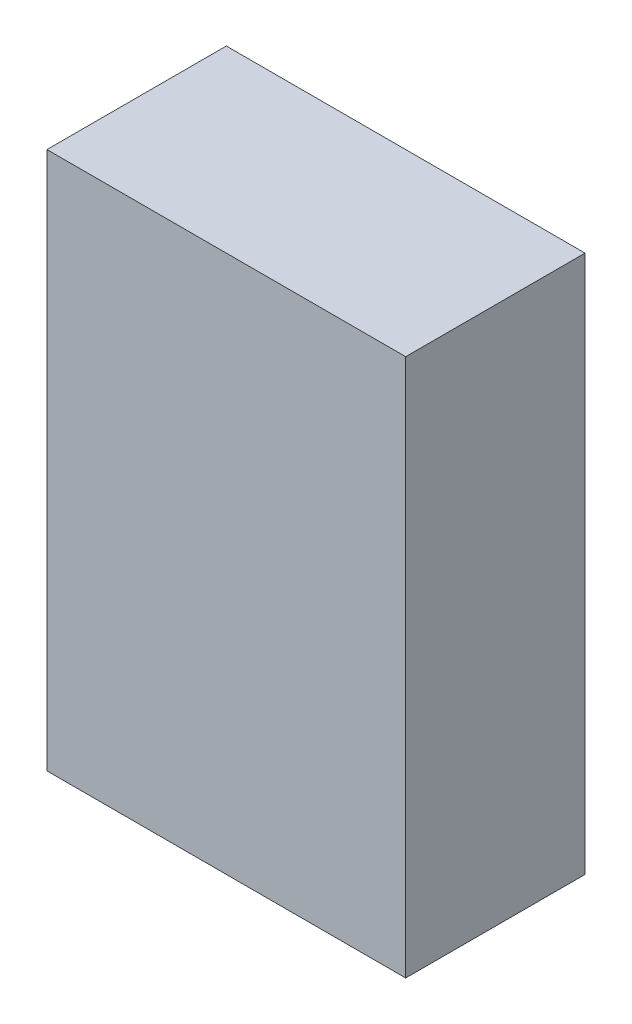
ISO-10303-21;
HEADER;
FILE_DESCRIPTION(('STEP AP214'),'2;1');
FILE_NAME('part.step','',(''),(''),'','','');
FILE_SCHEMA(('AUTOMOTIVE_DESIGN { 1 0 10303 214 1 1 1 1 }'));
ENDSEC;
DATA;
#1=APPLICATION_CONTEXT('core data for automotive mechanical design processes');
#2=APPLICATION_PROTOCOL_DEFINITION('international standard','automotive_design',2000,#1);
#3=PRODUCT_CONTEXT('',#1,'mechanical');
#4=PRODUCT('Part','Part','',(#3));
#5=PRODUCT_RELATED_PRODUCT_CATEGORY('part','',(#4));
#6=PRODUCT_DEFINITION_FORMATION('','',#4);
#7=PRODUCT_DEFINITION_CONTEXT('part definition',#1,'design');
#8=PRODUCT_DEFINITION('design','',#6,#7);
#9=PRODUCT_DEFINITION_SHAPE('','',#8);
#10=(LENGTH_UNIT() NAMED_UNIT(*) SI_UNIT(.MILLI.,.METRE.));
#11=(NAMED_UNIT(*) PLANE_ANGLE_UNIT() SI_UNIT($,.RADIAN.));
#12=(NAMED_UNIT(*) SI_UNIT($,.STERADIAN.) SOLID_ANGLE_UNIT());
#13=UNCERTAINTY_MEASURE_WITH_UNIT(LENGTH_MEASURE(1.E-05),#10,'distance_accuracy_value','');
#14=(GEOMETRIC_REPRESENTATION_CONTEXT(3) GLOBAL_UNCERTAINTY_ASSIGNED_CONTEXT((#13)) GLOBAL_UNIT_ASSIGNED_CONTEXT((#10,
#11,#12)) REPRESENTATION_CONTEXT('',''));
#15=CARTESIAN_POINT('',(0.,0.,0.));
#16=DIRECTION('',(0.,0.,1.));
#17=DIRECTION('',(1.,0.,0.));
#18=AXIS2_PLACEMENT_3D('',#15,#16,#17);
#19=CARTESIAN_POINT('',(-10.,-15.,10.));
#20=DIRECTION('',(1.,0.,0.));
#21=DIRECTION('',(0.,0.,-1.));
#22=AXIS2_PLACEMENT_3D('',#19,#20,#21);
#23=PLANE('',#22);
#24=DIRECTION('',(0.,-1.,0.));
#25=VECTOR('',#24,1.);
#26=CARTESIAN_POINT('',(-10.,-15.,0.));
#27=LINE('',#26,#25);
#28=CARTESIAN_POINT('',(-10.,15.,0.));
#29=VERTEX_POINT('',#28);
#30=CARTESIAN_POINT('',(-10.,-15.,0.));
#31=VERTEX_POINT('',#30);
#32=EDGE_CURVE('E101',#29,#31,#27,.T.);
#33=ORIENTED_EDGE('',*,*,#32,.T.);
#34=DIRECTION('',(0.,0.,-1.));
#35=VECTOR('',#34,1.);
#36=CARTESIAN_POINT('',(-10.,-15.,10.));
#37=LINE('',#36,#35);
#38=CARTESIAN_POINT('',(-10.,-15.,10.));
#39=VERTEX_POINT('',#38);
#40=EDGE_CURVE('E11',#39,#31,#37,.T.);
#41=ORIENTED_EDGE('',*,*,#40,.F.);
#42=DIRECTION('',(0.,-1.,0.));
#43=VECTOR('',#42,1.);
#44=CARTESIAN_POINT('',(-10.,-15.,10.));
#45=LINE('',#44,#43);
#46=CARTESIAN_POINT('',(-10.,15.,10.));
#47=VERTEX_POINT('',#46);
#48=EDGE_CURVE('E95',#47,#39,#45,.T.);
#49=ORIENTED_EDGE('',*,*,#48,.F.);
#50=DIRECTION('',(0.,0.,-1.));
#51=VECTOR('',#50,1.);
#52=CARTESIAN_POINT('',(-10.,15.,10.));
#53=LINE('',#52,#51);
#54=EDGE_CURVE('E99',#47,#29,#53,.T.);
#55=ORIENTED_EDGE('',*,*,#54,.T.);
#56=EDGE_LOOP('',(#33,#41,#49,#55));
#57=FACE_BOUND('',#56,.T.);
#58=ADVANCED_FACE('F41',(#57),#23,.F.);
#59=CARTESIAN_POINT('',(-10.,-15.,10.));
#60=DIRECTION('',(0.,1.,0.));
#61=DIRECTION('',(0.,0.,1.));
#62=AXIS2_PLACEMENT_3D('',#59,#60,#61);
#63=PLANE('',#62);
#64=DIRECTION('',(1.,0.,0.));
#65=VECTOR('',#64,1.);
#66=CARTESIAN_POINT('',(-10.,-15.,0.));
#67=LINE('',#66,#65);
#68=CARTESIAN_POINT('',(10.,-15.,0.));
#69=VERTEX_POINT('',#68);
#70=EDGE_CURVE('E96',#31,#69,#67,.T.);
#71=ORIENTED_EDGE('',*,*,#70,.T.);
#72=DIRECTION('',(0.,0.,-1.));
#73=VECTOR('',#72,1.);
#74=CARTESIAN_POINT('',(10.,-15.,10.));
#75=LINE('',#74,#73);
#76=CARTESIAN_POINT('',(10.,-15.,10.));
#77=VERTEX_POINT('',#76);
#78=EDGE_CURVE('E47',#77,#69,#75,.T.);
#79=ORIENTED_EDGE('',*,*,#78,.F.);
#80=DIRECTION('',(1.,0.,0.));
#81=VECTOR('',#80,1.);
#82=CARTESIAN_POINT('',(-10.,-15.,10.));
#83=LINE('',#82,#81);
#84=EDGE_CURVE('E90',#39,#77,#83,.T.);
#85=ORIENTED_EDGE('',*,*,#84,.F.);
#86=ORIENTED_EDGE('',*,*,#40,.T.);
#87=EDGE_LOOP('',(#71,#79,#85,#86));
#88=FACE_BOUND('',#87,.T.);
#89=ADVANCED_FACE('F94',(#88),#63,.F.);
#90=CARTESIAN_POINT('',(10.,-15.,10.));
#91=DIRECTION('',(-1.,0.,0.));
#92=DIRECTION('',(0.,0.,1.));
#93=AXIS2_PLACEMENT_3D('',#90,#91,#92);
#94=PLANE('',#93);
#95=DIRECTION('',(0.,1.,0.));
#96=VECTOR('',#95,1.);
#97=CARTESIAN_POINT('',(10.,-15.,0.));
#98=LINE('',#97,#96);
#99=CARTESIAN_POINT('',(10.,15.,0.));
#100=VERTEX_POINT('',#99);
#101=EDGE_CURVE('E73',#69,#100,#98,.T.);
#102=ORIENTED_EDGE('',*,*,#101,.T.);
#103=DIRECTION('',(0.,0.,-1.));
#104=VECTOR('',#103,1.);
#105=CARTESIAN_POINT('',(10.,15.,10.));
#106=LINE('',#105,#104);
#107=CARTESIAN_POINT('',(10.,15.,10.));
#108=VERTEX_POINT('',#107);
#109=EDGE_CURVE('E100',#108,#100,#106,.T.);
#110=ORIENTED_EDGE('',*,*,#109,.F.);
#111=DIRECTION('',(0.,1.,0.));
#112=VECTOR('',#111,1.);
#113=CARTESIAN_POINT('',(10.,-15.,10.));
#114=LINE('',#113,#112);
#115=EDGE_CURVE('E89',#77,#108,#114,.T.);
#116=ORIENTED_EDGE('',*,*,#115,.F.);
#117=ORIENTED_EDGE('',*,*,#78,.T.);
#118=EDGE_LOOP('',(#102,#110,#116,#117));
#119=FACE_BOUND('',#118,.T.);
#120=ADVANCED_FACE('F97',(#119),#94,.F.);
#121=CARTESIAN_POINT('',(-10.,15.,10.));
#122=DIRECTION('',(0.,-1.,0.));
#123=DIRECTION('',(0.,0.,-1.));
#124=AXIS2_PLACEMENT_3D('',#121,#122,#123);
#125=PLANE('',#124);
#126=DIRECTION('',(-1.,0.,0.));
#127=VECTOR('',#126,1.);
#128=CARTESIAN_POINT('',(-10.,15.,0.));
#129=LINE('',#128,#127);
#130=EDGE_CURVE('E79',#100,#29,#129,.T.);
#131=ORIENTED_EDGE('',*,*,#130,.T.);
#132=ORIENTED_EDGE('',*,*,#54,.F.);
#133=DIRECTION('',(-1.,0.,0.));
#134=VECTOR('',#133,1.);
#135=CARTESIAN_POINT('',(-10.,15.,10.));
#136=LINE('',#135,#134);
#137=EDGE_CURVE('E60',#108,#47,#136,.T.);
#138=ORIENTED_EDGE('',*,*,#137,.F.);
#139=ORIENTED_EDGE('',*,*,#109,.T.);
#140=EDGE_LOOP('',(#131,#132,#138,#139));
#141=FACE_BOUND('',#140,.T.);
#142=ADVANCED_FACE('F112',(#141),#125,.F.);
#143=CARTESIAN_POINT('',(0.,0.,10.));
#144=DIRECTION('',(0.,0.,-1.));
#145=DIRECTION('',(-1.,0.,0.));
#146=AXIS2_PLACEMENT_3D('',#143,#144,#145);
#147=PLANE('',#146);
#148=ORIENTED_EDGE('',*,*,#48,.T.);
#149=ORIENTED_EDGE('',*,*,#84,.T.);
#150=ORIENTED_EDGE('',*,*,#115,.T.);
#151=ORIENTED_EDGE('',*,*,#137,.T.);
#152=EDGE_LOOP('',(#148,#149,#150,#151));
#153=FACE_BOUND('',#152,.T.);
#154=ADVANCED_FACE('F88',(#153),#147,.F.);
#155=CARTESIAN_POINT('',(0.,0.,0.));
#156=DIRECTION('',(0.,0.,-1.));
#157=DIRECTION('',(-1.,0.,0.));
#158=AXIS2_PLACEMENT_3D('',#155,#156,#157);
#159=PLANE('',#158);
#160=ORIENTED_EDGE('',*,*,#32,.F.);
#161=ORIENTED_EDGE('',*,*,#130,.F.);
#162=ORIENTED_EDGE('',*,*,#101,.F.);
#163=ORIENTED_EDGE('',*,*,#70,.F.);
#164=EDGE_LOOP('',(#160,#161,#162,#163));
#165=FACE_BOUND('',#164,.T.);
#166=ADVANCED_FACE('F114',(#165),#159,.T.);
#167=CLOSED_SHELL('',(#58,#89,#120,#142,#154,#166));
#168=MANIFOLD_SOLID_BREP('B2',#167);
#169=ADVANCED_BREP_SHAPE_REPRESENTATION('',(#18,#168),#14);
#170=SHAPE_DEFINITION_REPRESENTATION(#9,#169);
ENDSEC;
END-ISO-10303-21;
